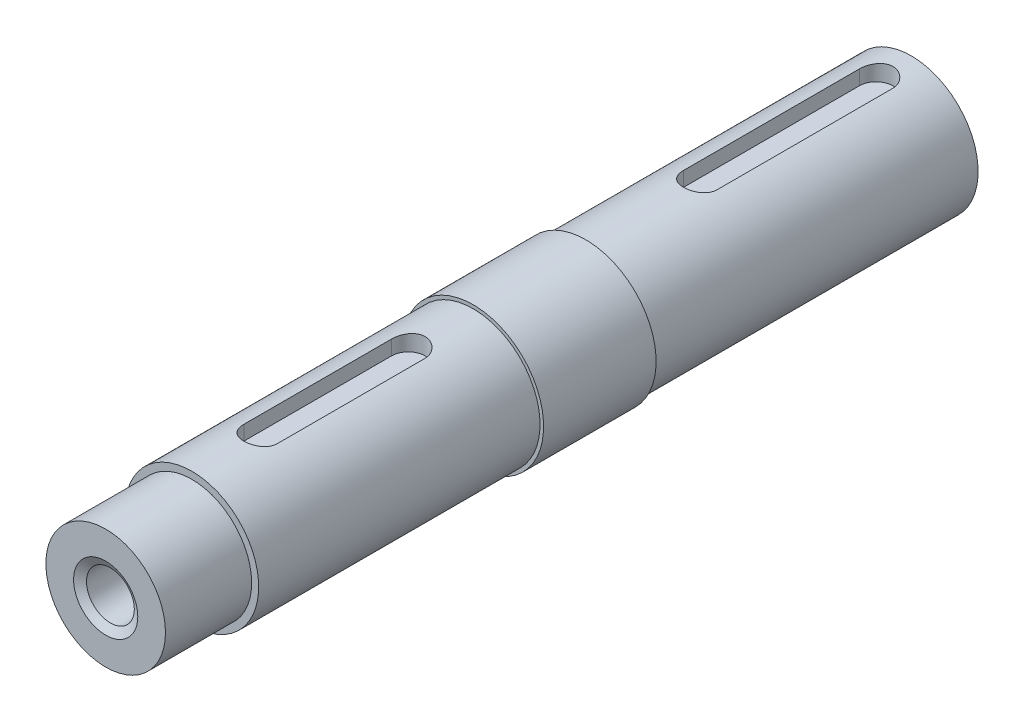
ISO-10303-21;
HEADER;
FILE_DESCRIPTION(('STEP AP214'),'2;1');
FILE_NAME('part.step','',(''),(''),'','','');
FILE_SCHEMA(('AUTOMOTIVE_DESIGN { 1 0 10303 214 1 1 1 1 }'));
ENDSEC;
DATA;
#1=APPLICATION_CONTEXT('core data for automotive mechanical design processes');
#2=APPLICATION_PROTOCOL_DEFINITION('international standard','automotive_design',2000,#1);
#3=PRODUCT_CONTEXT('',#1,'mechanical');
#4=PRODUCT('Part','Part','',(#3));
#5=PRODUCT_RELATED_PRODUCT_CATEGORY('part','',(#4));
#6=PRODUCT_DEFINITION_FORMATION('','',#4);
#7=PRODUCT_DEFINITION_CONTEXT('part definition',#1,'design');
#8=PRODUCT_DEFINITION('design','',#6,#7);
#9=PRODUCT_DEFINITION_SHAPE('','',#8);
#10=(LENGTH_UNIT() NAMED_UNIT(*) SI_UNIT(.MILLI.,.METRE.));
#11=(NAMED_UNIT(*) PLANE_ANGLE_UNIT() SI_UNIT($,.RADIAN.));
#12=(NAMED_UNIT(*) SI_UNIT($,.STERADIAN.) SOLID_ANGLE_UNIT());
#13=UNCERTAINTY_MEASURE_WITH_UNIT(LENGTH_MEASURE(1.E-05),#10,'distance_accuracy_value','');
#14=(GEOMETRIC_REPRESENTATION_CONTEXT(3) GLOBAL_UNCERTAINTY_ASSIGNED_CONTEXT((#13)) GLOBAL_UNIT_ASSIGNED_CONTEXT((#10,
#11,#12)) REPRESENTATION_CONTEXT('',''));
#15=CARTESIAN_POINT('',(0.,0.,0.));
#16=DIRECTION('',(0.,0.,1.));
#17=DIRECTION('',(1.,0.,0.));
#18=AXIS2_PLACEMENT_3D('',#15,#16,#17);
#19=CARTESIAN_POINT('',(-823.489345222977,-340.25157,-59.1466353350256));
#20=DIRECTION('',(0.,0.,1.));
#21=DIRECTION('',(0.,-1.,0.));
#22=AXIS2_PLACEMENT_3D('',#19,#20,#21);
#23=CONICAL_SURFACE('',#22,3.39999999982443,1.02974425858158);
#24=CARTESIAN_POINT('',(-823.489345223322,-340.25157,-61.1895614397611));
#25=VERTEX_POINT('',#24);
#26=VERTEX_LOOP('',#25);
#27=FACE_BOUND('',#26,.T.);
#28=CARTESIAN_POINT('',(-823.489345222977,-340.25157,-59.146635334911));
#29=DIRECTION('',(0.,0.,1.));
#30=DIRECTION('',(1.,0.,0.));
#31=AXIS2_PLACEMENT_3D('',#28,#29,#30);
#32=CIRCLE('',#31,3.4);
#33=CARTESIAN_POINT('',(-820.089345222977,-340.25157,-59.146635334911));
#34=VERTEX_POINT('',#33);
#35=EDGE_CURVE('E130',#34,#34,#32,.T.);
#36=ORIENTED_EDGE('',*,*,#35,.T.);
#37=EDGE_LOOP('',(#36));
#38=FACE_BOUND('',#37,.T.);
#39=ADVANCED_FACE('F17',(#27,#38),#23,.F.);
#40=CARTESIAN_POINT('',(-823.489345222977,-340.25157,-35.646635334911));
#41=DIRECTION('',(0.,0.,1.));
#42=DIRECTION('',(1.,0.,0.));
#43=AXIS2_PLACEMENT_3D('',#40,#41,#42);
#44=CYLINDRICAL_SURFACE('',#43,3.4);
#45=ORIENTED_EDGE('',*,*,#35,.F.);
#46=EDGE_LOOP('',(#45));
#47=FACE_BOUND('',#46,.T.);
#48=CARTESIAN_POINT('',(-823.489345222977,-340.25157,-36.0678050228671));
#49=DIRECTION('',(0.,0.,1.));
#50=DIRECTION('',(1.,0.,0.));
#51=AXIS2_PLACEMENT_3D('',#48,#49,#50);
#52=CIRCLE('',#51,3.40000000005181);
#53=CARTESIAN_POINT('',(-820.089345222925,-340.25157,-36.0678050228671));
#54=VERTEX_POINT('',#53);
#55=EDGE_CURVE('E127',#54,#54,#52,.T.);
#56=ORIENTED_EDGE('',*,*,#55,.T.);
#57=EDGE_LOOP('',(#56));
#58=FACE_BOUND('',#57,.T.);
#59=ADVANCED_FACE('F272',(#47,#58),#44,.F.);
#60=CARTESIAN_POINT('',(-823.489345222977,-340.25157,-35.3966353350188));
#61=DIRECTION('',(0.,0.,1.));
#62=DIRECTION('',(1.,0.,0.));
#63=AXIS2_PLACEMENT_3D('',#60,#61,#62);
#64=CONICAL_SURFACE('',#63,4.5624999999021,1.04719755120111);
#65=CARTESIAN_POINT('',(-823.489345222977,-340.25157,-35.3966353349507));
#66=DIRECTION('',(0.,0.,1.));
#67=DIRECTION('',(1.,0.,0.));
#68=AXIS2_PLACEMENT_3D('',#65,#66,#67);
#69=CIRCLE('',#68,4.56250000002001);
#70=CARTESIAN_POINT('',(-818.926845222957,-340.25157,-35.3966353349507));
#71=VERTEX_POINT('',#70);
#72=EDGE_CURVE('E20',#71,#71,#69,.T.);
#73=ORIENTED_EDGE('',*,*,#72,.T.);
#74=EDGE_LOOP('',(#73));
#75=FACE_BOUND('',#74,.T.);
#76=ORIENTED_EDGE('',*,*,#55,.F.);
#77=EDGE_LOOP('',(#76));
#78=FACE_BOUND('',#77,.T.);
#79=ADVANCED_FACE('F258',(#75,#78),#64,.F.);
#80=CARTESIAN_POINT('',(-748.489347611488,-340.251572168843,-35.396635334911));
#81=DIRECTION('',(0.,0.,-1.));
#82=DIRECTION('',(-1.,0.,0.));
#83=AXIS2_PLACEMENT_3D('',#80,#81,#82);
#84=PLANE('',#83);
#85=CARTESIAN_POINT('',(-823.489347611488,-340.251572168843,-35.396635334911));
#86=DIRECTION('',(0.,0.,1.));
#87=DIRECTION('',(1.,0.,0.));
#88=AXIS2_PLACEMENT_3D('',#85,#86,#87);
#89=CIRCLE('',#88,8.5);
#90=CARTESIAN_POINT('',(-814.989347611488,-340.251572168843,-35.396635334911));
#91=VERTEX_POINT('',#90);
#92=EDGE_CURVE('E251',#91,#91,#89,.F.);
#93=ORIENTED_EDGE('',*,*,#92,.F.);
#94=EDGE_LOOP('',(#93));
#95=FACE_BOUND('',#94,.T.);
#96=ORIENTED_EDGE('',*,*,#72,.F.);
#97=EDGE_LOOP('',(#96));
#98=FACE_BOUND('',#97,.T.);
#99=ADVANCED_FACE('F261',(#95,#98),#84,.F.);
#100=CARTESIAN_POINT('',(-825.870597611488,-333.132822168843,-79.1602681489316));
#101=DIRECTION('',(0.,-1.,0.));
#102=DIRECTION('',(0.,0.,-1.));
#103=AXIS2_PLACEMENT_3D('',#100,#101,#102);
#104=PLANE('',#103);
#105=CARTESIAN_POINT('',(-823.489347611488,-333.132822168843,-78.4227681489316));
#106=DIRECTION('',(0.,1.,0.));
#107=DIRECTION('',(0.,0.,1.));
#108=AXIS2_PLACEMENT_3D('',#105,#106,#107);
#109=CIRCLE('',#108,2.38125);
#110=CARTESIAN_POINT('',(-821.108097611488,-333.132822168843,-78.4227681489316));
#111=VERTEX_POINT('',#110);
#112=CARTESIAN_POINT('',(-825.870597611488,-333.132822168843,-78.4227681489316));
#113=VERTEX_POINT('',#112);
#114=EDGE_CURVE('E126',#111,#113,#109,.T.);
#115=ORIENTED_EDGE('',*,*,#114,.T.);
#116=DIRECTION('',(0.,0.,1.));
#117=VECTOR('',#116,1.);
#118=CARTESIAN_POINT('',(-825.870597611488,-333.132822168843,-79.1602681489316));
#119=LINE('',#118,#117);
#120=CARTESIAN_POINT('',(-825.870597611488,-333.132822168843,-57.4227681489315));
#121=VERTEX_POINT('',#120);
#122=EDGE_CURVE('E115',#113,#121,#119,.T.);
#123=ORIENTED_EDGE('',*,*,#122,.T.);
#124=CARTESIAN_POINT('',(-823.489347611488,-333.132822168843,-57.4227681489315));
#125=DIRECTION('',(0.,1.,0.));
#126=DIRECTION('',(0.,0.,1.));
#127=AXIS2_PLACEMENT_3D('',#124,#125,#126);
#128=CIRCLE('',#127,2.38125);
#129=CARTESIAN_POINT('',(-821.108097611488,-333.132822168843,-57.4227681489315));
#130=VERTEX_POINT('',#129);
#131=EDGE_CURVE('E121',#121,#130,#128,.T.);
#132=ORIENTED_EDGE('',*,*,#131,.T.);
#133=DIRECTION('',(0.,0.,-1.));
#134=VECTOR('',#133,1.);
#135=CARTESIAN_POINT('',(-821.108097611488,-333.132822168843,-79.1602681489316));
#136=LINE('',#135,#134);
#137=EDGE_CURVE('E82',#130,#111,#136,.T.);
#138=ORIENTED_EDGE('',*,*,#137,.T.);
#139=EDGE_LOOP('',(#115,#123,#132,#138));
#140=FACE_BOUND('',#139,.T.);
#141=ADVANCED_FACE('F263',(#140),#104,.F.);
#142=CARTESIAN_POINT('',(-823.489347611488,-340.251572168843,-26.1216353349109));
#143=DIRECTION('',(0.,0.,1.));
#144=DIRECTION('',(1.,0.,0.));
#145=AXIS2_PLACEMENT_3D('',#142,#143,#144);
#146=CYLINDRICAL_SURFACE('',#145,8.5);
#147=ORIENTED_EDGE('',*,*,#92,.T.);
#148=EDGE_LOOP('',(#147));
#149=FACE_BOUND('',#148,.T.);
#150=CARTESIAN_POINT('',(-823.489347611488,-340.251572168843,-47.6466353349109));
#151=DIRECTION('',(0.,0.,1.));
#152=DIRECTION('',(1.,0.,0.));
#153=AXIS2_PLACEMENT_3D('',#150,#151,#152);
#154=CIRCLE('',#153,8.5);
#155=CARTESIAN_POINT('',(-814.989347611488,-340.251572168843,-47.6466353349109));
#156=VERTEX_POINT('',#155);
#157=EDGE_CURVE('E114',#156,#156,#154,.T.);
#158=ORIENTED_EDGE('',*,*,#157,.T.);
#159=EDGE_LOOP('',(#158));
#160=FACE_BOUND('',#159,.T.);
#161=ADVANCED_FACE('F270',(#149,#160),#146,.T.);
#162=CARTESIAN_POINT('',(-823.489347611488,-333.132822168842,-78.4227681489316));
#163=DIRECTION('',(0.,1.,0.));
#164=DIRECTION('',(0.,0.,1.));
#165=AXIS2_PLACEMENT_3D('',#162,#163,#164);
#166=CYLINDRICAL_SURFACE('',#165,2.38125);
#167=ORIENTED_EDGE('',*,*,#114,.F.);
#168=DIRECTION('',(0.,1.,0.));
#169=VECTOR('',#168,1.);
#170=CARTESIAN_POINT('',(-821.108097611488,-333.132822168843,-78.4227681489316));
#171=LINE('',#170,#169);
#172=CARTESIAN_POINT('',(-821.108097611488,-331.054852729961,-78.4227681489316));
#173=VERTEX_POINT('',#172);
#174=EDGE_CURVE('E122',#111,#173,#171,.T.);
#175=ORIENTED_EDGE('',*,*,#174,.T.);
#176=CARTESIAN_POINT('',(-825.870597611488,-331.054852729961,-78.4227681489316));
#177=CARTESIAN_POINT('',(-825.870605246755,-331.05486010957,-78.4886159258194));
#178=CARTESIAN_POINT('',(-825.86786643286,-331.054145698006,-78.5544591694117));
#179=CARTESIAN_POINT('',(-825.85695521039,-331.051328025973,-78.6856531744129));
#180=CARTESIAN_POINT('',(-825.848783719733,-331.049225000129,-78.7510040171331));
#181=CARTESIAN_POINT('',(-825.827087934503,-331.043690289544,-78.8806237755675));
#182=CARTESIAN_POINT('',(-825.813574282422,-331.040261246748,-78.9448945791152));
#183=CARTESIAN_POINT('',(-825.78131976131,-331.032182929257,-79.0720147154577));
#184=CARTESIAN_POINT('',(-825.762578819636,-331.027533637606,-79.1348640284856));
#185=CARTESIAN_POINT('',(-825.698721003406,-331.011950113258,-79.3206114266293));
#186=CARTESIAN_POINT('',(-825.645947071507,-330.999374241706,-79.4408395993297));
#187=CARTESIAN_POINT('',(-825.521613073299,-330.971274024145,-79.6707101439363));
#188=CARTESIAN_POINT('',(-825.450047924639,-330.955748880778,-79.7803496409954));
#189=CARTESIAN_POINT('',(-825.288468566301,-330.923117054143,-79.9883966161352));
#190=CARTESIAN_POINT('',(-825.198117154221,-330.905985144882,-80.0865387496911));
#191=CARTESIAN_POINT('',(-825.00225367225,-330.872287863404,-80.2664485539829));
#192=CARTESIAN_POINT('',(-824.896739182257,-330.855722582149,-80.3482136058585));
#193=CARTESIAN_POINT('',(-824.671714076086,-330.824745132794,-80.4941417867546));
#194=CARTESIAN_POINT('',(-824.552027937446,-330.810366416133,-80.5580419988129));
#195=CARTESIAN_POINT('',(-824.303198438794,-330.785672620992,-80.6647122606809));
#196=CARTESIAN_POINT('',(-824.17405695266,-330.775356739903,-80.7074864843317));
#197=CARTESIAN_POINT('',(-823.912765910671,-330.760129318496,-80.7698385625876));
#198=CARTESIAN_POINT('',(-823.780731023904,-330.755112087277,-80.7898706832616));
#199=CARTESIAN_POINT('',(-823.51508282044,-330.750678861506,-80.8075959625038));
#200=CARTESIAN_POINT('',(-823.381469705475,-330.751262158656,-80.805291945913));
#201=CARTESIAN_POINT('',(-823.119614922223,-330.757885858691,-80.7787359832082));
#202=CARTESIAN_POINT('',(-822.991319922204,-330.763804212335,-80.7549748859591));
#203=CARTESIAN_POINT('',(-822.740600679496,-330.780290754499,-80.6869686277672));
#204=CARTESIAN_POINT('',(-822.618176697602,-330.790859149366,-80.6427225577932));
#205=CARTESIAN_POINT('',(-822.381380236055,-330.815644930064,-80.5346054385255));
#206=CARTESIAN_POINT('',(-822.267091036215,-330.829894603904,-80.4705596980945));
#207=CARTESIAN_POINT('',(-822.050713252611,-330.860497158781,-80.3247950371498));
#208=CARTESIAN_POINT('',(-821.948626522097,-330.876850358511,-80.2430734373981));
#209=CARTESIAN_POINT('',(-821.756631925107,-330.910401822157,-80.0616579016326));
#210=CARTESIAN_POINT('',(-821.667129080772,-330.927610977356,-79.9615369313894));
#211=CARTESIAN_POINT('',(-821.506072180938,-330.960533609431,-79.7474975696143));
#212=CARTESIAN_POINT('',(-821.434523040012,-330.976246676044,-79.6335754128285));
#213=CARTESIAN_POINT('',(-821.311137852576,-331.004440463709,-79.3943511411763));
#214=CARTESIAN_POINT('',(-821.259410936395,-331.016903173377,-79.2689906027108));
#215=CARTESIAN_POINT('',(-821.177958951834,-331.036949467608,-79.0110388488616));
#216=CARTESIAN_POINT('',(-821.148200987415,-331.044540344956,-78.8784587649153));
#217=CARTESIAN_POINT('',(-821.122645795735,-331.051096067702,-78.6910692759338));
#218=CARTESIAN_POINT('',(-821.117189302374,-331.052502629809,-78.6375196562826));
#219=CARTESIAN_POINT('',(-821.109919296897,-331.054380550734,-78.530244568809));
#220=CARTESIAN_POINT('',(-821.108099895255,-331.054853421459,-78.4765195266098));
#221=CARTESIAN_POINT('',(-821.108097611488,-331.054852729961,-78.4227681489745));
#222=B_SPLINE_CURVE_WITH_KNOTS('',3,(#176,#177,#178,#179,#180,#181,#182,#183,#184,#185,#186,
#187,#188,#189,#190,#191,#192,#193,#194,#195,#196,#197,#198,#199,#200,#201,#202,#203,#204,#205,
#206,#207,#208,#209,#210,#211,#212,#213,#214,#215,#216,#217,#218,#219,#220,#221),.UNSPECIFIED.,
.F.,.F.,(4,2,2,2,2,2,2,2,2,2,2,2,2,2,2,2,2,2,2,2,2,2,4),(0.,0.19747470414049,0.39491605092838,
0.591966027368938,0.789018742246165,1.18273133142486,1.57655051563353,1.97816649734545,
2.37984665031217,2.78715969626238,3.19439223754353,3.59333885448208,3.99223501748336,
4.38223101538159,4.77224432120981,5.16580193710758,5.55941924879623,5.96370362092652,
6.3680985397823,6.77468890082823,7.18066919669196,7.34209975317504,7.50326869345777),.UNSPECIFIED.);
#223=CARTESIAN_POINT('',(-825.870597611488,-331.054852729961,-78.4227681489316));
#224=VERTEX_POINT('',#223);
#225=EDGE_CURVE('E210',#224,#173,#222,.T.);
#226=ORIENTED_EDGE('',*,*,#225,.F.);
#227=DIRECTION('',(0.,1.,0.));
#228=VECTOR('',#227,1.);
#229=CARTESIAN_POINT('',(-825.870597611488,-330.751572168843,-78.4227681489316));
#230=LINE('',#229,#228);
#231=EDGE_CURVE('E116',#224,#113,#230,.F.);
#232=ORIENTED_EDGE('',*,*,#231,.T.);
#233=EDGE_LOOP('',(#167,#175,#226,#232));
#234=FACE_BOUND('',#233,.T.);
#235=ADVANCED_FACE('F320',(#234),#166,.F.);
#236=CARTESIAN_POINT('',(-821.108097611488,-333.132822168843,-79.1602681489316));
#237=DIRECTION('',(1.,0.,0.));
#238=DIRECTION('',(0.,0.,-1.));
#239=AXIS2_PLACEMENT_3D('',#236,#237,#238);
#240=PLANE('',#239);
#241=ORIENTED_EDGE('',*,*,#137,.F.);
#242=DIRECTION('',(0.,1.,0.));
#243=VECTOR('',#242,1.);
#244=CARTESIAN_POINT('',(-821.108097611488,-333.132822168842,-57.4227681489315));
#245=LINE('',#244,#243);
#246=CARTESIAN_POINT('',(-821.108097611488,-331.054852729961,-57.4227681488171));
#247=VERTEX_POINT('',#246);
#248=EDGE_CURVE('E119',#130,#247,#245,.T.);
#249=ORIENTED_EDGE('',*,*,#248,.T.);
#250=DIRECTION('',(0.,0.,-1.));
#251=VECTOR('',#250,1.);
#252=CARTESIAN_POINT('',(-821.108097611488,-331.054852729961,-149.921635334911));
#253=LINE('',#252,#251);
#254=EDGE_CURVE('E110',#173,#247,#253,.F.);
#255=ORIENTED_EDGE('',*,*,#254,.F.);
#256=ORIENTED_EDGE('',*,*,#174,.F.);
#257=EDGE_LOOP('',(#241,#249,#255,#256));
#258=FACE_BOUND('',#257,.T.);
#259=ADVANCED_FACE('F242',(#258),#240,.F.);
#260=CARTESIAN_POINT('',(-823.489347611488,-333.132822168842,-57.4227681489315));
#261=DIRECTION('',(0.,1.,0.));
#262=DIRECTION('',(0.,0.,1.));
#263=AXIS2_PLACEMENT_3D('',#260,#261,#262);
#264=CYLINDRICAL_SURFACE('',#263,2.38125);
#265=CARTESIAN_POINT('',(-821.108097611488,-331.054852729961,-57.4227681487026));
#266=CARTESIAN_POINT('',(-821.108089976228,-331.054860109569,-57.3569203718143));
#267=CARTESIAN_POINT('',(-821.110828790129,-331.054145698002,-57.2910771282219));
#268=CARTESIAN_POINT('',(-821.121740012612,-331.051328025967,-57.1598831232208));
#269=CARTESIAN_POINT('',(-821.129911503276,-331.049225000121,-57.0945322805011));
#270=CARTESIAN_POINT('',(-821.151607288518,-331.043690289533,-56.964912522068));
#271=CARTESIAN_POINT('',(-821.165120940605,-331.040261246735,-56.9006417185212));
#272=CARTESIAN_POINT('',(-821.19737546173,-331.032182929242,-56.7735215821812));
#273=CARTESIAN_POINT('',(-821.216116403409,-331.027533637588,-56.7106722691548));
#274=CARTESIAN_POINT('',(-821.279974219659,-331.011950113236,-56.5249248710163));
#275=CARTESIAN_POINT('',(-821.33274815157,-330.999374241682,-56.4046966983206));
#276=CARTESIAN_POINT('',(-821.457082149801,-330.971274024118,-56.1748261537251));
#277=CARTESIAN_POINT('',(-821.528647298472,-330.955748880749,-56.0651866566724));
#278=CARTESIAN_POINT('',(-821.690226656833,-330.923117054113,-55.8571396815474));
#279=CARTESIAN_POINT('',(-821.780578068923,-330.905985144851,-55.7589975479997));
#280=CARTESIAN_POINT('',(-821.976441550913,-330.872287863374,-55.5790877437262));
#281=CARTESIAN_POINT('',(-822.081956040916,-330.85572258212,-55.4973226918605));
#282=CARTESIAN_POINT('',(-822.306981147103,-330.824745132767,-55.3513945109869));
#283=CARTESIAN_POINT('',(-822.42666728575,-330.810366416108,-55.287494298941));
#284=CARTESIAN_POINT('',(-822.675496784412,-330.785672620972,-55.1808240370986));
#285=CARTESIAN_POINT('',(-822.804638270551,-330.775356739886,-55.138049813461));
#286=CARTESIAN_POINT('',(-823.065929312545,-330.760129318485,-55.0756977352322));
#287=CARTESIAN_POINT('',(-823.197964199313,-330.75511208727,-55.0556656145718));
#288=CARTESIAN_POINT('',(-823.463612402777,-330.750678861505,-55.0379403353568));
#289=CARTESIAN_POINT('',(-823.59722551774,-330.751262158659,-55.040244351961));
#290=CARTESIAN_POINT('',(-823.859080300988,-330.7578858587,-55.0668003146919));
#291=CARTESIAN_POINT('',(-823.987375301005,-330.763804212347,-55.0905614119536));
#292=CARTESIAN_POINT('',(-824.238094543705,-330.780290754517,-55.1585676701702));
#293=CARTESIAN_POINT('',(-824.360518525593,-330.790859149386,-55.2028137401561));
#294=CARTESIAN_POINT('',(-824.59731498713,-330.815644930089,-55.3109308594472));
#295=CARTESIAN_POINT('',(-824.711604186965,-330.82989460393,-55.37497659989));
#296=CARTESIAN_POINT('',(-824.927981970555,-330.860497158811,-55.5207412608572));
#297=CARTESIAN_POINT('',(-825.030068701062,-330.876850358541,-55.6024628606197));
#298=CARTESIAN_POINT('',(-825.222063298035,-330.910401822188,-55.7838783964057));
#299=CARTESIAN_POINT('',(-825.31156614236,-330.927610977386,-55.8839993666586));
#300=CARTESIAN_POINT('',(-825.472623042174,-330.96053360946,-56.0980387284517));
#301=CARTESIAN_POINT('',(-825.544172183089,-330.976246676072,-56.2119608852458));
#302=CARTESIAN_POINT('',(-825.6675573705,-331.004440463732,-56.4511851569114));
#303=CARTESIAN_POINT('',(-825.719284286668,-331.016903173398,-56.576545695382));
#304=CARTESIAN_POINT('',(-825.800736271203,-331.036949467623,-56.8344974492389));
#305=CARTESIAN_POINT('',(-825.830494235607,-331.044540344968,-56.9670775331878));
#306=CARTESIAN_POINT('',(-825.856049427264,-331.051096067708,-57.1544670221382));
#307=CARTESIAN_POINT('',(-825.861505920617,-331.052502629813,-57.2080166417565));
#308=CARTESIAN_POINT('',(-825.868775926083,-331.054380550735,-57.3152917291639));
#309=CARTESIAN_POINT('',(-825.870595327722,-331.054853421459,-57.3690167713297));
#310=CARTESIAN_POINT('',(-825.870597611488,-331.054852729961,-57.4227681489315));
#311=B_SPLINE_CURVE_WITH_KNOTS('',3,(#265,#266,#267,#268,#269,#270,#271,#272,#273,#274,#275,
#276,#277,#278,#279,#280,#281,#282,#283,#284,#285,#286,#287,#288,#289,#290,#291,#292,#293,#294,
#295,#296,#297,#298,#299,#300,#301,#302,#303,#304,#305,#306,#307,#308,#309,#310),.UNSPECIFIED.,
.F.,.F.,(4,2,2,2,2,2,2,2,2,2,2,2,2,2,2,2,2,2,2,2,2,2,4),(0.,0.197474704141869,0.39491605093117,
0.591966027373069,0.789018742251611,1.18273133143295,1.57655051564426,1.97816649735963,
2.37984665032978,2.78715969627904,3.19439223755978,3.59333885449493,3.99223501749251,
4.38223101538963,4.77224432121701,5.16580193711763,5.55941924880918,5.96370362094217,
6.36809853980064,6.77468890084492,7.18066919670663,7.34209975308935,7.50326869327186),.UNSPECIFIED.);
#312=CARTESIAN_POINT('',(-825.870597611488,-331.054852729961,-57.4227681489315));
#313=VERTEX_POINT('',#312);
#314=EDGE_CURVE('E202',#247,#313,#311,.T.);
#315=ORIENTED_EDGE('',*,*,#314,.F.);
#316=ORIENTED_EDGE('',*,*,#248,.F.);
#317=ORIENTED_EDGE('',*,*,#131,.F.);
#318=DIRECTION('',(0.,1.,0.));
#319=VECTOR('',#318,1.);
#320=CARTESIAN_POINT('',(-825.870597611488,-330.751572168843,-57.4227681489315));
#321=LINE('',#320,#319);
#322=EDGE_CURVE('E112',#121,#313,#321,.T.);
#323=ORIENTED_EDGE('',*,*,#322,.T.);
#324=EDGE_LOOP('',(#315,#316,#317,#323));
#325=FACE_BOUND('',#324,.T.);
#326=ADVANCED_FACE('F222',(#325),#264,.F.);
#327=CARTESIAN_POINT('',(-825.870597611488,-330.751572168843,-79.1602681489316));
#328=DIRECTION('',(-1.,0.,0.));
#329=DIRECTION('',(0.,0.,1.));
#330=AXIS2_PLACEMENT_3D('',#327,#328,#329);
#331=PLANE('',#330);
#332=ORIENTED_EDGE('',*,*,#322,.F.);
#333=ORIENTED_EDGE('',*,*,#122,.F.);
#334=ORIENTED_EDGE('',*,*,#231,.F.);
#335=DIRECTION('',(0.,0.,-1.));
#336=VECTOR('',#335,1.);
#337=CARTESIAN_POINT('',(-825.870597611488,-331.054852729961,-149.921635334911));
#338=LINE('',#337,#336);
#339=EDGE_CURVE('E106',#313,#224,#338,.T.);
#340=ORIENTED_EDGE('',*,*,#339,.F.);
#341=EDGE_LOOP('',(#332,#333,#334,#340));
#342=FACE_BOUND('',#341,.T.);
#343=ADVANCED_FACE('F235',(#342),#331,.F.);
#344=CARTESIAN_POINT('',(-748.489347611488,-340.251572168843,-47.6466353349109));
#345=DIRECTION('',(0.,0.,-1.));
#346=DIRECTION('',(-1.,0.,0.));
#347=AXIS2_PLACEMENT_3D('',#344,#345,#346);
#348=PLANE('',#347);
#349=CARTESIAN_POINT('',(-823.489347611488,-340.251572168842,-47.6466353349109));
#350=DIRECTION('',(0.,0.,-1.));
#351=DIRECTION('',(-1.,0.,0.));
#352=AXIS2_PLACEMENT_3D('',#349,#350,#351);
#353=CIRCLE('',#352,9.5);
#354=CARTESIAN_POINT('',(-832.989347611488,-340.251572168842,-47.6466353349109));
#355=VERTEX_POINT('',#354);
#356=EDGE_CURVE('E100',#355,#355,#353,.T.);
#357=ORIENTED_EDGE('',*,*,#356,.F.);
#358=EDGE_LOOP('',(#357));
#359=FACE_BOUND('',#358,.T.);
#360=ORIENTED_EDGE('',*,*,#157,.F.);
#361=EDGE_LOOP('',(#360));
#362=FACE_BOUND('',#361,.T.);
#363=ADVANCED_FACE('F93',(#359,#362),#348,.F.);
#364=CARTESIAN_POINT('',(-823.489345222977,-340.25157,-126.421635334793));
#365=DIRECTION('',(0.,0.,-1.));
#366=DIRECTION('',(-1.,0.,0.));
#367=AXIS2_PLACEMENT_3D('',#364,#365,#366);
#368=CONICAL_SURFACE('',#367,3.39999999983287,1.02974425859605);
#369=CARTESIAN_POINT('',(-823.489345223379,-340.25157,-124.378709230143));
#370=VERTEX_POINT('',#369);
#371=VERTEX_LOOP('',#370);
#372=FACE_BOUND('',#371,.T.);
#373=CARTESIAN_POINT('',(-823.489345222977,-340.25157,-126.421635334911));
#374=DIRECTION('',(0.,0.,-1.));
#375=DIRECTION('',(-1.,0.,0.));
#376=AXIS2_PLACEMENT_3D('',#373,#374,#375);
#377=CIRCLE('',#376,3.4);
#378=CARTESIAN_POINT('',(-826.889345222977,-340.25157,-126.421635334911));
#379=VERTEX_POINT('',#378);
#380=EDGE_CURVE('E97',#379,#379,#377,.T.);
#381=ORIENTED_EDGE('',*,*,#380,.T.);
#382=EDGE_LOOP('',(#381));
#383=FACE_BOUND('',#382,.T.);
#384=ADVANCED_FACE('F89',(#372,#383),#368,.F.);
#385=CARTESIAN_POINT('',(-823.489347611488,-340.251572168842,-149.921635334911));
#386=DIRECTION('',(0.,0.,-1.));
#387=DIRECTION('',(-1.,0.,0.));
#388=AXIS2_PLACEMENT_3D('',#385,#386,#387);
#389=CYLINDRICAL_SURFACE('',#388,9.5);
#390=ORIENTED_EDGE('',*,*,#356,.T.);
#391=EDGE_LOOP('',(#390));
#392=FACE_BOUND('',#391,.T.);
#393=CARTESIAN_POINT('',(-823.489347611488,-340.251572168842,-87.6466353349109));
#394=DIRECTION('',(0.,0.,-1.));
#395=DIRECTION('',(-1.,0.,0.));
#396=AXIS2_PLACEMENT_3D('',#393,#394,#395);
#397=CIRCLE('',#396,9.5);
#398=CARTESIAN_POINT('',(-832.989347611488,-340.251572168842,-87.6466353349109));
#399=VERTEX_POINT('',#398);
#400=EDGE_CURVE('E99',#399,#399,#397,.F.);
#401=ORIENTED_EDGE('',*,*,#400,.T.);
#402=EDGE_LOOP('',(#401));
#403=FACE_BOUND('',#402,.T.);
#404=ORIENTED_EDGE('',*,*,#314,.T.);
#405=ORIENTED_EDGE('',*,*,#339,.T.);
#406=ORIENTED_EDGE('',*,*,#225,.T.);
#407=ORIENTED_EDGE('',*,*,#254,.T.);
#408=EDGE_LOOP('',(#404,#405,#406,#407));
#409=FACE_BOUND('',#408,.T.);
#410=ADVANCED_FACE('F92',(#392,#403,#409),#389,.T.);
#411=CARTESIAN_POINT('',(-821.045433137804,-349.690310540326,-87.6466353349109));
#412=DIRECTION('',(0.,0.,-1.));
#413=DIRECTION('',(-1.,0.,0.));
#414=AXIS2_PLACEMENT_3D('',#411,#412,#413);
#415=PLANE('',#414);
#416=CARTESIAN_POINT('',(-823.489347611488,-340.251572168842,-87.6466353349109));
#417=DIRECTION('',(0.,0.,-1.));
#418=DIRECTION('',(-1.,0.,0.));
#419=AXIS2_PLACEMENT_3D('',#416,#417,#418);
#420=CIRCLE('',#419,10.);
#421=CARTESIAN_POINT('',(-833.489347611488,-340.251572168842,-87.6466353349109));
#422=VERTEX_POINT('',#421);
#423=EDGE_CURVE('E103',#422,#422,#420,.T.);
#424=ORIENTED_EDGE('',*,*,#423,.F.);
#425=EDGE_LOOP('',(#424));
#426=FACE_BOUND('',#425,.T.);
#427=ORIENTED_EDGE('',*,*,#400,.F.);
#428=EDGE_LOOP('',(#427));
#429=FACE_BOUND('',#428,.T.);
#430=ADVANCED_FACE('F229',(#426,#429),#415,.F.);
#431=CARTESIAN_POINT('',(-823.489345222977,-340.25157,-149.921635334911));
#432=DIRECTION('',(0.,0.,-1.));
#433=DIRECTION('',(-1.,0.,0.));
#434=AXIS2_PLACEMENT_3D('',#431,#432,#433);
#435=CYLINDRICAL_SURFACE('',#434,3.4);
#436=ORIENTED_EDGE('',*,*,#380,.F.);
#437=EDGE_LOOP('',(#436));
#438=FACE_BOUND('',#437,.T.);
#439=CARTESIAN_POINT('',(-823.489345222977,-340.25157,-149.250465646958));
#440=DIRECTION('',(0.,0.,-1.));
#441=DIRECTION('',(-1.,0.,0.));
#442=AXIS2_PLACEMENT_3D('',#439,#440,#441);
#443=CIRCLE('',#442,3.40000000006024);
#444=CARTESIAN_POINT('',(-826.889345223037,-340.25157,-149.250465646958));
#445=VERTEX_POINT('',#444);
#446=EDGE_CURVE('E199',#445,#445,#443,.T.);
#447=ORIENTED_EDGE('',*,*,#446,.T.);
#448=EDGE_LOOP('',(#447));
#449=FACE_BOUND('',#448,.T.);
#450=ADVANCED_FACE('F372',(#438,#449),#435,.F.);
#451=CARTESIAN_POINT('',(-825.870597611488,-333.132822168843,-149.921635334911));
#452=DIRECTION('',(0.,1.,0.));
#453=DIRECTION('',(0.,0.,1.));
#454=AXIS2_PLACEMENT_3D('',#451,#452,#453);
#455=PLANE('',#454);
#456=CARTESIAN_POINT('',(-823.489347611488,-333.132822168842,-119.921635334911));
#457=DIRECTION('',(0.,1.,0.));
#458=DIRECTION('',(0.,0.,1.));
#459=AXIS2_PLACEMENT_3D('',#456,#457,#458);
#460=CIRCLE('',#459,2.38125);
#461=CARTESIAN_POINT('',(-825.870597611488,-333.132822168842,-119.921635334911));
#462=VERTEX_POINT('',#461);
#463=CARTESIAN_POINT('',(-821.108097611488,-333.132822168842,-119.921635334911));
#464=VERTEX_POINT('',#463);
#465=EDGE_CURVE('E191',#462,#464,#460,.T.);
#466=ORIENTED_EDGE('',*,*,#465,.T.);
#467=DIRECTION('',(0.,0.,1.));
#468=VECTOR('',#467,1.);
#469=CARTESIAN_POINT('',(-821.108097611488,-333.132822168843,-149.921635334911));
#470=LINE('',#469,#468);
#471=CARTESIAN_POINT('',(-821.108097611488,-333.132822168843,-144.921635334911));
#472=VERTEX_POINT('',#471);
#473=EDGE_CURVE('E194',#472,#464,#470,.T.);
#474=ORIENTED_EDGE('',*,*,#473,.F.);
#475=CARTESIAN_POINT('',(-823.489347611488,-333.132822168843,-144.921635334911));
#476=DIRECTION('',(0.,1.,0.));
#477=DIRECTION('',(0.,0.,1.));
#478=AXIS2_PLACEMENT_3D('',#475,#476,#477);
#479=CIRCLE('',#478,2.38125000000002);
#480=CARTESIAN_POINT('',(-825.870597611488,-333.132822168842,-144.921635334911));
#481=VERTEX_POINT('',#480);
#482=EDGE_CURVE('E195',#472,#481,#479,.T.);
#483=ORIENTED_EDGE('',*,*,#482,.T.);
#484=DIRECTION('',(0.,0.,-1.));
#485=VECTOR('',#484,1.);
#486=CARTESIAN_POINT('',(-825.870597611488,-333.132822168842,-149.921635334911));
#487=LINE('',#486,#485);
#488=EDGE_CURVE('E179',#462,#481,#487,.T.);
#489=ORIENTED_EDGE('',*,*,#488,.F.);
#490=EDGE_LOOP('',(#466,#474,#483,#489));
#491=FACE_BOUND('',#490,.T.);
#492=ADVANCED_FACE('F381',(#491),#455,.T.);
#493=CARTESIAN_POINT('',(-823.489347611488,-340.251572168842,-95.6466353349109));
#494=DIRECTION('',(0.,0.,-1.));
#495=DIRECTION('',(-1.,0.,0.));
#496=AXIS2_PLACEMENT_3D('',#493,#494,#495);
#497=CYLINDRICAL_SURFACE('',#496,10.);
#498=CARTESIAN_POINT('',(-823.489347611488,-340.251572168842,-103.646635334911));
#499=DIRECTION('',(0.,0.,-1.));
#500=DIRECTION('',(-1.,0.,0.));
#501=AXIS2_PLACEMENT_3D('',#498,#499,#500);
#502=CIRCLE('',#501,10.);
#503=CARTESIAN_POINT('',(-833.489347611488,-340.251572168842,-103.646635334911));
#504=VERTEX_POINT('',#503);
#505=EDGE_CURVE('E183',#504,#504,#502,.T.);
#506=ORIENTED_EDGE('',*,*,#505,.F.);
#507=EDGE_LOOP('',(#506));
#508=FACE_BOUND('',#507,.T.);
#509=ORIENTED_EDGE('',*,*,#423,.T.);
#510=EDGE_LOOP('',(#509));
#511=FACE_BOUND('',#510,.T.);
#512=ADVANCED_FACE('F389',(#508,#511),#497,.T.);
#513=CARTESIAN_POINT('',(-823.489345222977,-340.25157,-149.921635334863));
#514=DIRECTION('',(0.,0.,-1.));
#515=DIRECTION('',(-1.,0.,0.));
#516=AXIS2_PLACEMENT_3D('',#513,#514,#515);
#517=CONICAL_SURFACE('',#516,4.56250000002423,1.04719755120111);
#518=CARTESIAN_POINT('',(-823.489345222977,-340.25157,-149.92163533486));
#519=DIRECTION('',(0.,0.,-1.));
#520=DIRECTION('',(-1.,0.,0.));
#521=AXIS2_PLACEMENT_3D('',#518,#519,#520);
#522=CIRCLE('',#521,4.56250000002001);
#523=CARTESIAN_POINT('',(-828.051845222997,-340.25157,-149.92163533486));
#524=VERTEX_POINT('',#523);
#525=EDGE_CURVE('E467',#524,#524,#522,.F.);
#526=ORIENTED_EDGE('',*,*,#525,.F.);
#527=EDGE_LOOP('',(#526));
#528=FACE_BOUND('',#527,.T.);
#529=ORIENTED_EDGE('',*,*,#446,.F.);
#530=EDGE_LOOP('',(#529));
#531=FACE_BOUND('',#530,.T.);
#532=ADVANCED_FACE('F399',(#528,#531),#517,.F.);
#533=CARTESIAN_POINT('',(-823.489347611488,-333.132822168843,-144.921635334911));
#534=DIRECTION('',(0.,1.,0.));
#535=DIRECTION('',(0.,0.,1.));
#536=AXIS2_PLACEMENT_3D('',#533,#534,#535);
#537=CYLINDRICAL_SURFACE('',#536,2.38125000000002);
#538=DIRECTION('',(0.,1.,0.));
#539=VECTOR('',#538,1.);
#540=CARTESIAN_POINT('',(-821.108097611488,-333.132822168843,-144.921635334911));
#541=LINE('',#540,#539);
#542=CARTESIAN_POINT('',(-821.108097611488,-331.054852729961,-144.921635334911));
#543=VERTEX_POINT('',#542);
#544=EDGE_CURVE('E192',#543,#472,#541,.F.);
#545=ORIENTED_EDGE('',*,*,#544,.F.);
#546=CARTESIAN_POINT('',(-825.870597611488,-331.054852729961,-144.921635334853));
#547=CARTESIAN_POINT('',(-825.870605246756,-331.054860109571,-144.987483111741));
#548=CARTESIAN_POINT('',(-825.867866432863,-331.054145698007,-145.053326355333));
#549=CARTESIAN_POINT('',(-825.856955210396,-331.051328025975,-145.184520360334));
#550=CARTESIAN_POINT('',(-825.84878371974,-331.049225000131,-145.249871203055));
#551=CARTESIAN_POINT('',(-825.827087934514,-331.043690289547,-145.37949096149));
#552=CARTESIAN_POINT('',(-825.813574282435,-331.040261246751,-145.443761765038));
#553=CARTESIAN_POINT('',(-825.781319761326,-331.032182929261,-145.570881901381));
#554=CARTESIAN_POINT('',(-825.762578819654,-331.02753363761,-145.633731214409));
#555=CARTESIAN_POINT('',(-825.698721003428,-331.011950113263,-145.819478612554));
#556=CARTESIAN_POINT('',(-825.645947071532,-330.999374241712,-145.939706785255));
#557=CARTESIAN_POINT('',(-825.521613073331,-330.971274024152,-146.169577329865));
#558=CARTESIAN_POINT('',(-825.450047924674,-330.955748880785,-146.279216826926));
#559=CARTESIAN_POINT('',(-825.28846856634,-330.923117054151,-146.487263802069));
#560=CARTESIAN_POINT('',(-825.198117154263,-330.905985144889,-146.585405935627));
#561=CARTESIAN_POINT('',(-825.002253672298,-330.872287863412,-146.765315739923));
#562=CARTESIAN_POINT('',(-824.896739182307,-330.855722582157,-146.847080791802));
#563=CARTESIAN_POINT('',(-824.67171407614,-330.8247451328,-146.993008972703));
#564=CARTESIAN_POINT('',(-824.552027937502,-330.810366416139,-147.056909184765));
#565=CARTESIAN_POINT('',(-824.303198438853,-330.785672620997,-147.163579446639));
#566=CARTESIAN_POINT('',(-824.17405695272,-330.775356739908,-147.206353670293));
#567=CARTESIAN_POINT('',(-823.912765910732,-330.760129318499,-147.268705748556));
#568=CARTESIAN_POINT('',(-823.780731023965,-330.755112087279,-147.288737869234));
#569=CARTESIAN_POINT('',(-823.515082820501,-330.750678861506,-147.306463148483));
#570=CARTESIAN_POINT('',(-823.381469705536,-330.751262158656,-147.304159131895));
#571=CARTESIAN_POINT('',(-823.119614922282,-330.757885858689,-147.277603169197));
#572=CARTESIAN_POINT('',(-822.991319922262,-330.763804212332,-147.253842071951));
#573=CARTESIAN_POINT('',(-822.740600679552,-330.780290754494,-147.185835813765));
#574=CARTESIAN_POINT('',(-822.618176697658,-330.790859149361,-147.141589743794));
#575=CARTESIAN_POINT('',(-822.381380236107,-330.815644930058,-147.033472624533));
#576=CARTESIAN_POINT('',(-822.267091036266,-330.829894603897,-146.969426884104));
#577=CARTESIAN_POINT('',(-822.050713252659,-330.860497158774,-146.823662223165));
#578=CARTESIAN_POINT('',(-821.948626522143,-330.876850358503,-146.741940623416));
#579=CARTESIAN_POINT('',(-821.756631925149,-330.910401822149,-146.560525087656));
#580=CARTESIAN_POINT('',(-821.667129080811,-330.927610977348,-146.460404117415));
#581=CARTESIAN_POINT('',(-821.506072180972,-330.960533609423,-146.246364755645));
#582=CARTESIAN_POINT('',(-821.434523040043,-330.976246676038,-146.132442598861));
#583=CARTESIAN_POINT('',(-821.311137852601,-331.004440463703,-145.893218327212));
#584=CARTESIAN_POINT('',(-821.259410936417,-331.016903173372,-145.767857788748));
#585=CARTESIAN_POINT('',(-821.177958951849,-331.036949467604,-145.509906034901));
#586=CARTESIAN_POINT('',(-821.148200987427,-331.044540344953,-145.377325950955));
#587=CARTESIAN_POINT('',(-821.122645795739,-331.051096067701,-145.189936461957));
#588=CARTESIAN_POINT('',(-821.117189302377,-331.052502629809,-145.136386842289));
#589=CARTESIAN_POINT('',(-821.109919296897,-331.054380550734,-145.02911175478));
#590=CARTESIAN_POINT('',(-821.108099895254,-331.054853421459,-144.975386712564));
#591=CARTESIAN_POINT('',(-821.108097611488,-331.054852729961,-144.921635334911));
#592=B_SPLINE_CURVE_WITH_KNOTS('',3,(#546,#547,#548,#549,#550,#551,#552,#553,#554,#555,#556,
#557,#558,#559,#560,#561,#562,#563,#564,#565,#566,#567,#568,#569,#570,#571,#572,#573,#574,#575,
#576,#577,#578,#579,#580,#581,#582,#583,#584,#585,#586,#587,#588,#589,#590,#591),.UNSPECIFIED.,
.F.,.F.,(4,2,2,2,2,2,2,2,2,2,2,2,2,2,2,2,2,2,2,2,2,2,4),(0.,0.197474704140141,0.394916050927728,
0.591966027367912,0.789018742244774,1.18273133142278,1.57655051563078,1.97816649734193,
2.3798466503076,2.78715969625791,3.19439223753932,3.59333885447885,3.99223501748106,
4.38223101537952,4.77224432120809,5.16580193710509,5.559419248793,5.96370362092266,
6.36809853977771,6.77468890082406,7.18066919668829,7.34209975322352,7.50326869355838),.UNSPECIFIED.);
#593=CARTESIAN_POINT('',(-825.870597611488,-331.054852729961,-144.921635334882));
#594=VERTEX_POINT('',#593);
#595=EDGE_CURVE('E145',#594,#543,#592,.T.);
#596=ORIENTED_EDGE('',*,*,#595,.F.);
#597=DIRECTION('',(0.,1.,0.));
#598=VECTOR('',#597,1.);
#599=CARTESIAN_POINT('',(-825.870597611488,-330.751572168843,-144.921635334911));
#600=LINE('',#599,#598);
#601=EDGE_CURVE('E181',#481,#594,#600,.T.);
#602=ORIENTED_EDGE('',*,*,#601,.F.);
#603=ORIENTED_EDGE('',*,*,#482,.F.);
#604=EDGE_LOOP('',(#545,#596,#602,#603));
#605=FACE_BOUND('',#604,.T.);
#606=ADVANCED_FACE('F409',(#605),#537,.F.);
#607=CARTESIAN_POINT('',(-821.108097611488,-333.132822168843,-149.921635334911));
#608=DIRECTION('',(-1.,0.,0.));
#609=DIRECTION('',(0.,0.,1.));
#610=AXIS2_PLACEMENT_3D('',#607,#608,#609);
#611=PLANE('',#610);
#612=DIRECTION('',(0.,1.,0.));
#613=VECTOR('',#612,1.);
#614=CARTESIAN_POINT('',(-821.108097611488,-333.132822168842,-119.921635334911));
#615=LINE('',#614,#613);
#616=CARTESIAN_POINT('',(-821.108097611488,-331.054852729961,-119.921635334912));
#617=VERTEX_POINT('',#616);
#618=EDGE_CURVE('E185',#464,#617,#615,.T.);
#619=ORIENTED_EDGE('',*,*,#618,.T.);
#620=DIRECTION('',(0.,0.,-1.));
#621=VECTOR('',#620,1.);
#622=CARTESIAN_POINT('',(-821.108097611488,-331.054852729961,-149.921635334911));
#623=LINE('',#622,#621);
#624=EDGE_CURVE('E144',#543,#617,#623,.F.);
#625=ORIENTED_EDGE('',*,*,#624,.F.);
#626=ORIENTED_EDGE('',*,*,#544,.T.);
#627=ORIENTED_EDGE('',*,*,#473,.T.);
#628=EDGE_LOOP('',(#619,#625,#626,#627));
#629=FACE_BOUND('',#628,.T.);
#630=ADVANCED_FACE('F175',(#629),#611,.T.);
#631=CARTESIAN_POINT('',(-823.489347611488,-333.132822168842,-119.921635334911));
#632=DIRECTION('',(0.,1.,0.));
#633=DIRECTION('',(0.,0.,1.));
#634=AXIS2_PLACEMENT_3D('',#631,#632,#633);
#635=CYLINDRICAL_SURFACE('',#634,2.38125);
#636=ORIENTED_EDGE('',*,*,#618,.F.);
#637=ORIENTED_EDGE('',*,*,#465,.F.);
#638=DIRECTION('',(0.,1.,0.));
#639=VECTOR('',#638,1.);
#640=CARTESIAN_POINT('',(-825.870597611488,-330.751572168843,-119.921635334911));
#641=LINE('',#640,#639);
#642=CARTESIAN_POINT('',(-825.870597611488,-331.054852729961,-119.921635334911));
#643=VERTEX_POINT('',#642);
#644=EDGE_CURVE('E35',#643,#462,#641,.F.);
#645=ORIENTED_EDGE('',*,*,#644,.F.);
#646=CARTESIAN_POINT('',(-821.108097611488,-331.054852729961,-119.921635334913));
#647=CARTESIAN_POINT('',(-821.108089976221,-331.05486010957,-119.855787558025));
#648=CARTESIAN_POINT('',(-821.110828790116,-331.054145698006,-119.789944314433));
#649=CARTESIAN_POINT('',(-821.121740012587,-331.051328025973,-119.658750309432));
#650=CARTESIAN_POINT('',(-821.129911503243,-331.049225000129,-119.593399466712));
#651=CARTESIAN_POINT('',(-821.151607288473,-331.043690289544,-119.463779708277));
#652=CARTESIAN_POINT('',(-821.165120940553,-331.040261246748,-119.399508904729));
#653=CARTESIAN_POINT('',(-821.197375461666,-331.032182929257,-119.272388768387));
#654=CARTESIAN_POINT('',(-821.216116403339,-331.027533637606,-119.209539455359));
#655=CARTESIAN_POINT('',(-821.27997421957,-331.011950113258,-119.023792057215));
#656=CARTESIAN_POINT('',(-821.332748151468,-330.999374241706,-118.903563884515));
#657=CARTESIAN_POINT('',(-821.457082149676,-330.971274024145,-118.673693339908));
#658=CARTESIAN_POINT('',(-821.528647298335,-330.955748880778,-118.564053842849));
#659=CARTESIAN_POINT('',(-821.690226656674,-330.923117054144,-118.356006867709));
#660=CARTESIAN_POINT('',(-821.780578068754,-330.905985144882,-118.257864734153));
#661=CARTESIAN_POINT('',(-821.976441550724,-330.872287863405,-118.077954929861));
#662=CARTESIAN_POINT('',(-822.081956040718,-330.855722582149,-117.996189877985));
#663=CARTESIAN_POINT('',(-822.306981146888,-330.824745132794,-117.850261697089));
#664=CARTESIAN_POINT('',(-822.426667285528,-330.810366416133,-117.786361485031));
#665=CARTESIAN_POINT('',(-822.67549678418,-330.785672620992,-117.679691223162));
#666=CARTESIAN_POINT('',(-822.804638270314,-330.775356739904,-117.636916999512));
#667=CARTESIAN_POINT('',(-823.065929312303,-330.760129318496,-117.574564921255));
#668=CARTESIAN_POINT('',(-823.197964199069,-330.755112087277,-117.554532800581));
#669=CARTESIAN_POINT('',(-823.463612402534,-330.750678861506,-117.536807521339));
#670=CARTESIAN_POINT('',(-823.597225517499,-330.751262158656,-117.53911153793));
#671=CARTESIAN_POINT('',(-823.859080300751,-330.757885858691,-117.565667500634));
#672=CARTESIAN_POINT('',(-823.987375300771,-330.763804212335,-117.589428597883));
#673=CARTESIAN_POINT('',(-824.238094543479,-330.780290754499,-117.657434856075));
#674=CARTESIAN_POINT('',(-824.360518525372,-330.790859149366,-117.701680926049));
#675=CARTESIAN_POINT('',(-824.59731498692,-330.815644930064,-117.809798045316));
#676=CARTESIAN_POINT('',(-824.711604186759,-330.829894603904,-117.873843785747));
#677=CARTESIAN_POINT('',(-824.927981970363,-330.860497158781,-118.019608446692));
#678=CARTESIAN_POINT('',(-825.030068700878,-330.876850358511,-118.101330046443));
#679=CARTESIAN_POINT('',(-825.222063297867,-330.910401822156,-118.282745582209));
#680=CARTESIAN_POINT('',(-825.311566142203,-330.927610977356,-118.382866552452));
#681=CARTESIAN_POINT('',(-825.472623042037,-330.960533609431,-118.596905914226));
#682=CARTESIAN_POINT('',(-825.544172182963,-330.976246676044,-118.710828071012));
#683=CARTESIAN_POINT('',(-825.667557370399,-331.004440463708,-118.950052342664));
#684=CARTESIAN_POINT('',(-825.71928428658,-331.016903173377,-119.07541288113));
#685=CARTESIAN_POINT('',(-825.800736271142,-331.036949467608,-119.333364634979));
#686=CARTESIAN_POINT('',(-825.83049423556,-331.044540344956,-119.465944718925));
#687=CARTESIAN_POINT('',(-825.856049427242,-331.051096067702,-119.653334207914));
#688=CARTESIAN_POINT('',(-825.861505920603,-331.05250262981,-119.706883827573));
#689=CARTESIAN_POINT('',(-825.86877592608,-331.054380550735,-119.814158915061));
#690=CARTESIAN_POINT('',(-825.870595327722,-331.054853421459,-119.867883957268));
#691=CARTESIAN_POINT('',(-825.870597611488,-331.054852729961,-119.921635334911));
#692=B_SPLINE_CURVE_WITH_KNOTS('',3,(#646,#647,#648,#649,#650,#651,#652,#653,#654,#655,#656,
#657,#658,#659,#660,#661,#662,#663,#664,#665,#666,#667,#668,#669,#670,#671,#672,#673,#674,#675,
#676,#677,#678,#679,#680,#681,#682,#683,#684,#685,#686,#687,#688,#689,#690,#691),.UNSPECIFIED.,
.F.,.F.,(4,2,2,2,2,2,2,2,2,2,2,2,2,2,2,2,2,2,2,2,2,2,4),(0.,0.197474704140485,0.394916050928359,
0.591966027368894,0.789018742246107,1.18273133142475,1.57655051563339,1.97816649734531,
2.37984665031192,2.78715969626206,3.19439223754335,3.59333885448185,3.99223501748324,
4.38223101538151,4.77224432120972,5.16580193710756,5.55941924879621,5.96370362092645,
6.36809853978212,6.77468890082801,7.18066919669177,7.3420997531974,7.50326869350264),.UNSPECIFIED.);
#693=EDGE_CURVE('E136',#617,#643,#692,.T.);
#694=ORIENTED_EDGE('',*,*,#693,.F.);
#695=EDGE_LOOP('',(#636,#637,#645,#694));
#696=FACE_BOUND('',#695,.T.);
#697=ADVANCED_FACE('F151',(#696),#635,.F.);
#698=CARTESIAN_POINT('',(-825.870597611488,-330.751572168843,-149.921635334911));
#699=DIRECTION('',(1.,0.,0.));
#700=DIRECTION('',(0.,0.,-1.));
#701=AXIS2_PLACEMENT_3D('',#698,#699,#700);
#702=PLANE('',#701);
#703=ORIENTED_EDGE('',*,*,#644,.T.);
#704=ORIENTED_EDGE('',*,*,#488,.T.);
#705=ORIENTED_EDGE('',*,*,#601,.T.);
#706=DIRECTION('',(0.,0.,-1.));
#707=VECTOR('',#706,1.);
#708=CARTESIAN_POINT('',(-825.870597611488,-331.054852729961,-149.921635334911));
#709=LINE('',#708,#707);
#710=EDGE_CURVE('E135',#643,#594,#709,.T.);
#711=ORIENTED_EDGE('',*,*,#710,.F.);
#712=EDGE_LOOP('',(#703,#704,#705,#711));
#713=FACE_BOUND('',#712,.T.);
#714=ADVANCED_FACE('F167',(#713),#702,.T.);
#715=CARTESIAN_POINT('',(-821.045433137804,-349.690310540326,-103.646635334911));
#716=DIRECTION('',(0.,0.,-1.));
#717=DIRECTION('',(-1.,0.,0.));
#718=AXIS2_PLACEMENT_3D('',#715,#716,#717);
#719=PLANE('',#718);
#720=CARTESIAN_POINT('',(-823.489347611488,-340.251572168842,-103.646635334911));
#721=DIRECTION('',(0.,0.,-1.));
#722=DIRECTION('',(-1.,0.,0.));
#723=AXIS2_PLACEMENT_3D('',#720,#721,#722);
#724=CIRCLE('',#723,9.5);
#725=CARTESIAN_POINT('',(-832.989347611488,-340.251572168842,-103.646635334911));
#726=VERTEX_POINT('',#725);
#727=EDGE_CURVE('E26',#726,#726,#724,.T.);
#728=ORIENTED_EDGE('',*,*,#727,.F.);
#729=EDGE_LOOP('',(#728));
#730=FACE_BOUND('',#729,.T.);
#731=ORIENTED_EDGE('',*,*,#505,.T.);
#732=EDGE_LOOP('',(#731));
#733=FACE_BOUND('',#732,.T.);
#734=ADVANCED_FACE('F164',(#730,#733),#719,.T.);
#735=CARTESIAN_POINT('',(-823.489347611488,-340.251572168842,-149.921635334911));
#736=DIRECTION('',(0.,0.,-1.));
#737=DIRECTION('',(-1.,0.,0.));
#738=AXIS2_PLACEMENT_3D('',#735,#736,#737);
#739=PLANE('',#738);
#740=CARTESIAN_POINT('',(-823.489347611488,-340.251572168842,-149.921635334911));
#741=DIRECTION('',(0.,0.,-1.));
#742=DIRECTION('',(-1.,0.,0.));
#743=AXIS2_PLACEMENT_3D('',#740,#741,#742);
#744=CIRCLE('',#743,9.5);
#745=CARTESIAN_POINT('',(-832.989347611488,-340.251572168842,-149.921635334911));
#746=VERTEX_POINT('',#745);
#747=EDGE_CURVE('E11',#746,#746,#744,.F.);
#748=ORIENTED_EDGE('',*,*,#747,.F.);
#749=EDGE_LOOP('',(#748));
#750=FACE_BOUND('',#749,.T.);
#751=ORIENTED_EDGE('',*,*,#525,.T.);
#752=EDGE_LOOP('',(#751));
#753=FACE_BOUND('',#752,.T.);
#754=ADVANCED_FACE('F159',(#750,#753),#739,.T.);
#755=CARTESIAN_POINT('',(-823.489347611488,-340.251572168842,-149.921635334911));
#756=DIRECTION('',(0.,0.,-1.));
#757=DIRECTION('',(-1.,0.,0.));
#758=AXIS2_PLACEMENT_3D('',#755,#756,#757);
#759=CYLINDRICAL_SURFACE('',#758,9.5);
#760=ORIENTED_EDGE('',*,*,#747,.T.);
#761=EDGE_LOOP('',(#760));
#762=FACE_BOUND('',#761,.T.);
#763=ORIENTED_EDGE('',*,*,#727,.T.);
#764=EDGE_LOOP('',(#763));
#765=FACE_BOUND('',#764,.T.);
#766=ORIENTED_EDGE('',*,*,#693,.T.);
#767=ORIENTED_EDGE('',*,*,#710,.T.);
#768=ORIENTED_EDGE('',*,*,#595,.T.);
#769=ORIENTED_EDGE('',*,*,#624,.T.);
#770=EDGE_LOOP('',(#766,#767,#768,#769));
#771=FACE_BOUND('',#770,.T.);
#772=ADVANCED_FACE('F155',(#762,#765,#771),#759,.T.);
#773=CLOSED_SHELL('',(#39,#59,#79,#99,#141,#161,#235,#259,#326,#343,#363,#384,#410,#430,#450,
#492,#512,#532,#606,#630,#697,#714,#734,#754,#772));
#774=MANIFOLD_SOLID_BREP('B1',#773);
#775=ADVANCED_BREP_SHAPE_REPRESENTATION('',(#18,#774),#14);
#776=SHAPE_DEFINITION_REPRESENTATION(#9,#775);
ENDSEC;
END-ISO-10303-21;
